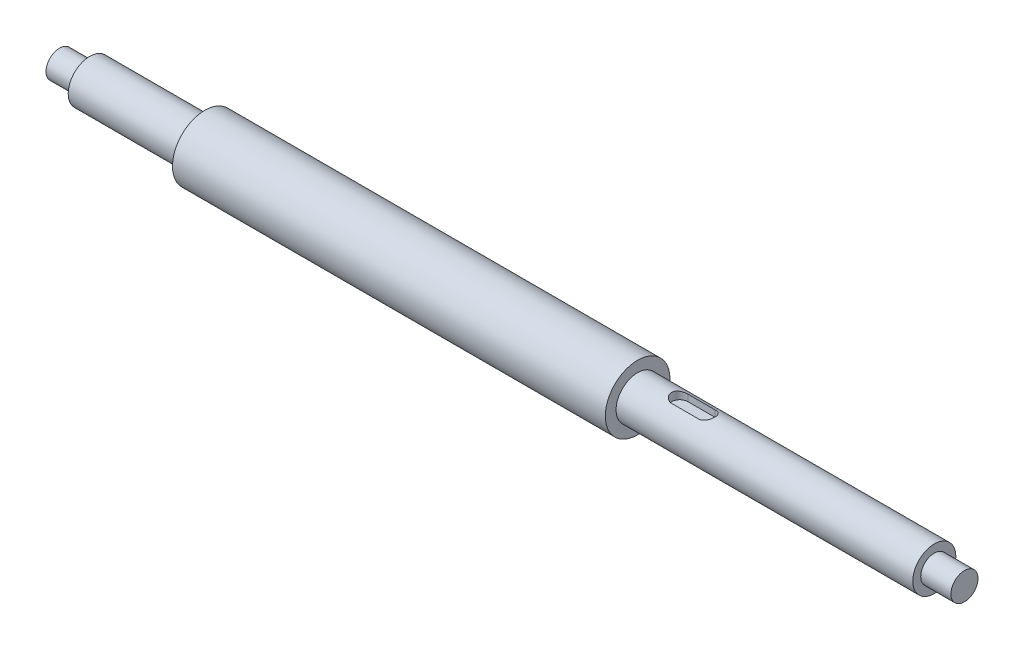
ISO-10303-21;
HEADER;
FILE_DESCRIPTION(('STEP AP214'),'2;1');
FILE_NAME('part.step','',(''),(''),'','','');
FILE_SCHEMA(('AUTOMOTIVE_DESIGN { 1 0 10303 214 1 1 1 1 }'));
ENDSEC;
DATA;
#1=APPLICATION_CONTEXT('core data for automotive mechanical design processes');
#2=APPLICATION_PROTOCOL_DEFINITION('international standard','automotive_design',2000,#1);
#3=PRODUCT_CONTEXT('',#1,'mechanical');
#4=PRODUCT('Part','Part','',(#3));
#5=PRODUCT_RELATED_PRODUCT_CATEGORY('part','',(#4));
#6=PRODUCT_DEFINITION_FORMATION('','',#4);
#7=PRODUCT_DEFINITION_CONTEXT('part definition',#1,'design');
#8=PRODUCT_DEFINITION('design','',#6,#7);
#9=PRODUCT_DEFINITION_SHAPE('','',#8);
#10=(LENGTH_UNIT() NAMED_UNIT(*) SI_UNIT(.MILLI.,.METRE.));
#11=(NAMED_UNIT(*) PLANE_ANGLE_UNIT() SI_UNIT($,.RADIAN.));
#12=(NAMED_UNIT(*) SI_UNIT($,.STERADIAN.) SOLID_ANGLE_UNIT());
#13=UNCERTAINTY_MEASURE_WITH_UNIT(LENGTH_MEASURE(1.E-05),#10,'distance_accuracy_value','');
#14=(GEOMETRIC_REPRESENTATION_CONTEXT(3) GLOBAL_UNCERTAINTY_ASSIGNED_CONTEXT((#13)) GLOBAL_UNIT_ASSIGNED_CONTEXT((#10,
#11,#12)) REPRESENTATION_CONTEXT('',''));
#15=CARTESIAN_POINT('',(0.,0.,0.));
#16=DIRECTION('',(0.,0.,1.));
#17=DIRECTION('',(1.,0.,0.));
#18=AXIS2_PLACEMENT_3D('',#15,#16,#17);
#19=CARTESIAN_POINT('',(170.3705,0.,0.));
#20=DIRECTION('',(1.,0.,0.));
#21=DIRECTION('',(0.,0.,-1.));
#22=AXIS2_PLACEMENT_3D('',#19,#20,#21);
#23=CYLINDRICAL_SURFACE('',#22,6.35);
#24=CARTESIAN_POINT('',(190.7286,5.88660754913218,2.38125000000001));
#25=CARTESIAN_POINT('',(190.793022690709,5.88659548978226,2.38125913009066));
#26=CARTESIAN_POINT('',(190.857438761514,5.88766481762426,2.37863587752652));
#27=CARTESIAN_POINT('',(190.985759428447,5.89187627506284,2.36819587169677));
#28=CARTESIAN_POINT('',(191.049664189017,5.89501770870095,2.36038086218097));
#29=CARTESIAN_POINT('',(191.176283215817,5.90326887586656,2.33966527786342));
#30=CARTESIAN_POINT('',(191.239000897483,5.90837159707846,2.32678281724141));
#31=CARTESIAN_POINT('',(191.363022489217,5.92037365929628,2.29607189211602));
#32=CARTESIAN_POINT('',(191.42432632721,5.92727309167544,2.27824317606367));
#33=CARTESIAN_POINT('',(191.605386908343,5.95034770392959,2.21760056465341));
#34=CARTESIAN_POINT('',(191.722518678819,5.96891509765018,2.16759271249364));
#35=CARTESIAN_POINT('',(191.946767896638,6.01031361974633,2.04999893449497));
#36=CARTESIAN_POINT('',(192.053877049666,6.03314823347984,1.9823986217298));
#37=CARTESIAN_POINT('',(192.260358513306,6.0817692865106,1.82795372701336));
#38=CARTESIAN_POINT('',(192.359166909958,6.10764225891527,1.74038090759022));
#39=CARTESIAN_POINT('',(192.541088192072,6.15870284454295,1.5500260305332));
#40=CARTESIAN_POINT('',(192.62419803932,6.1838903242937,1.44724103566693));
#41=CARTESIAN_POINT('',(192.775109530779,6.23177717528256,1.22506388505923));
#42=CARTESIAN_POINT('',(192.842293553956,6.25436262019899,1.10522541598501));
#43=CARTESIAN_POINT('',(192.955310058418,6.29345381482321,0.854953847338861));
#44=CARTESIAN_POINT('',(193.001150500312,6.30996183077482,0.724524719162075));
#45=CARTESIAN_POINT('',(193.06819034107,6.33442171009888,0.462740462488136));
#46=CARTESIAN_POINT('',(193.090367212537,6.34271188412668,0.331667882509103));
#47=CARTESIAN_POINT('',(193.112582411759,6.35101622276703,0.067414516862528));
#48=CARTESIAN_POINT('',(193.11262755105,6.35103293372286,-0.0657656075414556));
#49=CARTESIAN_POINT('',(193.091146380114,6.34300331869488,-0.323443758391492));
#50=CARTESIAN_POINT('',(193.070687207439,6.33535587077507,-0.448045336451245));
#51=CARTESIAN_POINT('',(193.010573670279,6.31338053854789,-0.691896438267902));
#52=CARTESIAN_POINT('',(192.970918215805,6.29905227489671,-0.811145657690647));
#53=CARTESIAN_POINT('',(192.873042001571,6.26487460828666,-1.04296990601517));
#54=CARTESIAN_POINT('',(192.814559377485,6.24494786671162,-1.15542250183511));
#55=CARTESIAN_POINT('',(192.680920140402,6.2015896125325,-1.36919723045466));
#56=CARTESIAN_POINT('',(192.605758104676,6.1781569609131,-1.47051572733593));
#57=CARTESIAN_POINT('',(192.435760778743,6.12858570839014,-1.66542402633577));
#58=CARTESIAN_POINT('',(192.340032539864,6.102368999608,-1.75821624577153));
#59=CARTESIAN_POINT('',(192.134197686679,6.05127511190241,-1.9267443869004));
#60=CARTESIAN_POINT('',(192.024085447748,6.02639846238961,-2.00247360465934));
#61=CARTESIAN_POINT('',(191.789434129892,5.98030090356382,-2.13626697322262));
#62=CARTESIAN_POINT('',(191.664624281002,5.95917580861293,-2.19389105876173));
#63=CARTESIAN_POINT('',(191.406134964076,5.92409675575384,-2.2869384432745));
#64=CARTESIAN_POINT('',(191.272470824669,5.91013075232921,-2.32239905555698));
#65=CARTESIAN_POINT('',(191.069307634484,5.89607385128455,-2.35774344632942));
#66=CARTESIAN_POINT('',(191.001487551886,5.89253768789074,-2.36655020107226));
#67=CARTESIAN_POINT('',(190.865324915666,5.88780085364897,-2.37830215533811));
#68=CARTESIAN_POINT('',(190.796982907066,5.88659801217854,-2.38125280268899));
#69=CARTESIAN_POINT('',(190.7286,5.88660754913219,-2.38124999999999));
#70=B_SPLINE_CURVE_WITH_KNOTS('',3,(#24,#25,#26,#27,#28,#29,#30,#31,#32,#33,#34,#35,#36,#37,#38,
#39,#40,#41,#42,#43,#44,#45,#46,#47,#48,#49,#50,#51,#52,#53,#54,#55,#56,#57,#58,#59,#60,#61,#62,
#63,#64,#65,#66,#67,#68,#69),.UNSPECIFIED.,.F.,.F.,(4,2,2,2,2,2,2,2,2,2,2,2,2,2,2,2,2,2,2,2,2,2,
4),(0.,0.193194726745108,0.386324598168466,0.57877028854756,0.771225767825263,1.15545658008769,
1.54000260504615,1.94182796306957,2.34373100873049,2.75931921641233,3.17475229591794,
3.57226821532385,3.96966179024043,4.34739430738592,4.7251482751968,5.10840147691071,
5.49177946305821,5.89755993176865,6.30349955186249,6.71865488111544,7.13310937965229,
7.33829571728318,7.54329108423838),.UNSPECIFIED.);
#71=CARTESIAN_POINT('',(190.7286,5.88660754913218,2.38125000000001));
#72=VERTEX_POINT('',#71);
#73=CARTESIAN_POINT('',(190.7286,5.88660754913219,-2.38124999999999));
#74=VERTEX_POINT('',#73);
#75=EDGE_CURVE('E132',#72,#74,#70,.T.);
#76=ORIENTED_EDGE('',*,*,#75,.F.);
#77=DIRECTION('',(1.,0.,0.));
#78=VECTOR('',#77,1.);
#79=CARTESIAN_POINT('',(170.3705,5.88660754913218,2.38125000000002));
#80=LINE('',#79,#78);
#81=CARTESIAN_POINT('',(182.7911,5.88660754913218,2.38125000000001));
#82=VERTEX_POINT('',#81);
#83=EDGE_CURVE('E11',#82,#72,#80,.T.);
#84=ORIENTED_EDGE('',*,*,#83,.F.);
#85=CARTESIAN_POINT('',(182.7911,5.88660754913219,-2.38124999999999));
#86=CARTESIAN_POINT('',(182.726677309291,5.88659548978227,-2.38125913009064));
#87=CARTESIAN_POINT('',(182.662261238486,5.88766481762427,-2.3786358775265));
#88=CARTESIAN_POINT('',(182.533940571553,5.89187627506284,-2.36819587169675));
#89=CARTESIAN_POINT('',(182.470035810983,5.89501770870096,-2.36038086218095));
#90=CARTESIAN_POINT('',(182.343416784183,5.90326887586656,-2.3396652778634));
#91=CARTESIAN_POINT('',(182.280699102517,5.90837159707847,-2.32678281724139));
#92=CARTESIAN_POINT('',(182.156677510783,5.92037365929629,-2.296071892116));
#93=CARTESIAN_POINT('',(182.09537367279,5.92727309167545,-2.27824317606365));
#94=CARTESIAN_POINT('',(181.914313091657,5.9503477039296,-2.21760056465339));
#95=CARTESIAN_POINT('',(181.797181321181,5.96891509765019,-2.16759271249363));
#96=CARTESIAN_POINT('',(181.572932103362,6.01031361974633,-2.04999893449496));
#97=CARTESIAN_POINT('',(181.465822950334,6.03314823347984,-1.98239862172978));
#98=CARTESIAN_POINT('',(181.259341486694,6.08176928651061,-1.82795372701334));
#99=CARTESIAN_POINT('',(181.160533090042,6.10764225891527,-1.7403809075902));
#100=CARTESIAN_POINT('',(180.978611807928,6.15870284454295,-1.55002603053317));
#101=CARTESIAN_POINT('',(180.89550196068,6.1838903242937,-1.44724103566691));
#102=CARTESIAN_POINT('',(180.744590469221,6.23177717528256,-1.22506388505921));
#103=CARTESIAN_POINT('',(180.677406446044,6.254362620199,-1.10522541598498));
#104=CARTESIAN_POINT('',(180.564389941582,6.29345381482321,-0.854953847338833));
#105=CARTESIAN_POINT('',(180.518549499688,6.30996183077482,-0.724524719162051));
#106=CARTESIAN_POINT('',(180.451509658929,6.33442171009888,-0.462740462488115));
#107=CARTESIAN_POINT('',(180.429332787463,6.34271188412668,-0.331667882509082));
#108=CARTESIAN_POINT('',(180.407117588241,6.35101622276703,-0.0674145168625059));
#109=CARTESIAN_POINT('',(180.407072448949,6.35103293372286,0.0657656075414779));
#110=CARTESIAN_POINT('',(180.428553619886,6.34300331869488,0.323443758391516));
#111=CARTESIAN_POINT('',(180.449012792561,6.33535587077507,0.448045336451272));
#112=CARTESIAN_POINT('',(180.509126329721,6.31338053854788,0.69189643826793));
#113=CARTESIAN_POINT('',(180.548781784195,6.2990522748967,0.811145657690672));
#114=CARTESIAN_POINT('',(180.646657998429,6.26487460828666,1.04296990601519));
#115=CARTESIAN_POINT('',(180.705140622515,6.24494786671162,1.15542250183512));
#116=CARTESIAN_POINT('',(180.838779859598,6.20158961253249,1.36919723045468));
#117=CARTESIAN_POINT('',(180.913941895324,6.17815696091309,1.47051572733595));
#118=CARTESIAN_POINT('',(181.083939221256,6.12858570839014,1.6654240263358));
#119=CARTESIAN_POINT('',(181.179667460136,6.10236899960799,1.75821624577155));
#120=CARTESIAN_POINT('',(181.385502313321,6.0512751119024,1.92674438690042));
#121=CARTESIAN_POINT('',(181.495614552252,6.0263984623896,2.00247360465936));
#122=CARTESIAN_POINT('',(181.730265870108,5.98030090356381,2.13626697322264));
#123=CARTESIAN_POINT('',(181.855075718998,5.95917580861292,2.19389105876174));
#124=CARTESIAN_POINT('',(182.113565035924,5.92409675575384,2.28693844327452));
#125=CARTESIAN_POINT('',(182.247229175331,5.91013075232921,2.322399055557));
#126=CARTESIAN_POINT('',(182.450392365516,5.89607385128454,2.35774344632944));
#127=CARTESIAN_POINT('',(182.518212448114,5.89253768789073,2.36655020107229));
#128=CARTESIAN_POINT('',(182.654375084334,5.88780085364896,2.37830215533813));
#129=CARTESIAN_POINT('',(182.722717092934,5.88659801217853,2.38125280268901));
#130=CARTESIAN_POINT('',(182.7911,5.88660754913218,2.38125000000001));
#131=B_SPLINE_CURVE_WITH_KNOTS('',3,(#85,#86,#87,#88,#89,#90,#91,#92,#93,#94,#95,#96,#97,#98,
#99,#100,#101,#102,#103,#104,#105,#106,#107,#108,#109,#110,#111,#112,#113,#114,#115,#116,#117,
#118,#119,#120,#121,#122,#123,#124,#125,#126,#127,#128,#129,#130),.UNSPECIFIED.,.F.,.F.,(4,2,2,
2,2,2,2,2,2,2,2,2,2,2,2,2,2,2,2,2,2,2,4),(0.,0.19319472674508,0.386324598168438,
0.57877028854756,0.771225767825263,1.15545658008766,1.54000260504615,1.94182796306957,
2.34373100873049,2.75931921641234,3.17475229591794,3.57226821532385,3.96966179024043,
4.34739430738593,4.7251482751968,5.1084014769107,5.49177946305821,5.89755993176865,
6.30349955186249,6.71865488111541,7.13310937965229,7.3382957172832,7.54329108423838),.UNSPECIFIED.);
#132=CARTESIAN_POINT('',(182.7911,5.88660754913219,-2.38124999999999));
#133=VERTEX_POINT('',#132);
#134=EDGE_CURVE('E41',#133,#82,#131,.T.);
#135=ORIENTED_EDGE('',*,*,#134,.F.);
#136=DIRECTION('',(1.,0.,0.));
#137=VECTOR('',#136,1.);
#138=CARTESIAN_POINT('',(170.3705,5.88660754913219,-2.38124999999999));
#139=LINE('',#138,#137);
#140=EDGE_CURVE('E140',#74,#133,#139,.F.);
#141=ORIENTED_EDGE('',*,*,#140,.F.);
#142=EDGE_LOOP('',(#76,#84,#135,#141));
#143=FACE_BOUND('',#142,.T.);
#144=CARTESIAN_POINT('',(170.3705,0.,0.));
#145=DIRECTION('',(1.,0.,0.));
#146=DIRECTION('',(0.,0.,-1.));
#147=AXIS2_PLACEMENT_3D('',#144,#145,#146);
#148=CIRCLE('',#147,6.35);
#149=CARTESIAN_POINT('',(170.3705,0.,-6.35));
#150=VERTEX_POINT('',#149);
#151=EDGE_CURVE('E111',#150,#150,#148,.T.);
#152=ORIENTED_EDGE('',*,*,#151,.T.);
#153=EDGE_LOOP('',(#152));
#154=FACE_BOUND('',#153,.T.);
#155=CARTESIAN_POINT('',(257.81,0.,0.));
#156=DIRECTION('',(-1.,0.,0.));
#157=DIRECTION('',(0.,0.,1.));
#158=AXIS2_PLACEMENT_3D('',#155,#156,#157);
#159=CIRCLE('',#158,6.35);
#160=CARTESIAN_POINT('',(257.81,0.,6.35));
#161=VERTEX_POINT('',#160);
#162=EDGE_CURVE('E106',#161,#161,#159,.T.);
#163=ORIENTED_EDGE('',*,*,#162,.T.);
#164=EDGE_LOOP('',(#163));
#165=FACE_BOUND('',#164,.T.);
#166=ADVANCED_FACE('F33',(#143,#154,#165),#23,.T.);
#167=CARTESIAN_POINT('',(266.7,0.,0.));
#168=DIRECTION('',(-1.,0.,0.));
#169=DIRECTION('',(0.,0.,1.));
#170=AXIS2_PLACEMENT_3D('',#167,#168,#169);
#171=CYLINDRICAL_SURFACE('',#170,9.525);
#172=CARTESIAN_POINT('',(42.799,0.,0.));
#173=DIRECTION('',(-1.,0.,0.));
#174=DIRECTION('',(0.,0.,1.));
#175=AXIS2_PLACEMENT_3D('',#172,#173,#174);
#176=CIRCLE('',#175,9.525);
#177=CARTESIAN_POINT('',(42.799,0.,9.525));
#178=VERTEX_POINT('',#177);
#179=EDGE_CURVE('E129',#178,#178,#176,.T.);
#180=ORIENTED_EDGE('',*,*,#179,.F.);
#181=EDGE_LOOP('',(#180));
#182=FACE_BOUND('',#181,.T.);
#183=CARTESIAN_POINT('',(170.3705,0.,0.));
#184=DIRECTION('',(1.,0.,0.));
#185=DIRECTION('',(0.,0.,-1.));
#186=AXIS2_PLACEMENT_3D('',#183,#184,#185);
#187=CIRCLE('',#186,9.525);
#188=CARTESIAN_POINT('',(170.3705,0.,-9.525));
#189=VERTEX_POINT('',#188);
#190=EDGE_CURVE('E114',#189,#189,#187,.T.);
#191=ORIENTED_EDGE('',*,*,#190,.F.);
#192=EDGE_LOOP('',(#191));
#193=FACE_BOUND('',#192,.T.);
#194=ADVANCED_FACE('F35',(#182,#193),#171,.T.);
#195=CARTESIAN_POINT('',(42.799,0.,0.));
#196=DIRECTION('',(-1.,0.,0.));
#197=DIRECTION('',(0.,0.,1.));
#198=AXIS2_PLACEMENT_3D('',#195,#196,#197);
#199=CYLINDRICAL_SURFACE('',#198,6.35);
#200=CARTESIAN_POINT('',(42.799,0.,0.));
#201=DIRECTION('',(-1.,0.,0.));
#202=DIRECTION('',(0.,0.,1.));
#203=AXIS2_PLACEMENT_3D('',#200,#201,#202);
#204=CIRCLE('',#203,6.35);
#205=CARTESIAN_POINT('',(42.799,0.,6.35));
#206=VERTEX_POINT('',#205);
#207=EDGE_CURVE('E126',#206,#206,#204,.T.);
#208=ORIENTED_EDGE('',*,*,#207,.T.);
#209=EDGE_LOOP('',(#208));
#210=FACE_BOUND('',#209,.T.);
#211=CARTESIAN_POINT('',(8.89,0.,0.));
#212=DIRECTION('',(-1.,0.,0.));
#213=DIRECTION('',(0.,0.,1.));
#214=AXIS2_PLACEMENT_3D('',#211,#212,#213);
#215=CIRCLE('',#214,6.35);
#216=CARTESIAN_POINT('',(8.89,0.,6.35));
#217=VERTEX_POINT('',#216);
#218=EDGE_CURVE('E121',#217,#217,#215,.T.);
#219=ORIENTED_EDGE('',*,*,#218,.F.);
#220=EDGE_LOOP('',(#219));
#221=FACE_BOUND('',#220,.T.);
#222=ADVANCED_FACE('F206',(#210,#221),#199,.T.);
#223=CARTESIAN_POINT('',(42.799,0.,0.));
#224=DIRECTION('',(-1.,0.,0.));
#225=DIRECTION('',(0.,0.,1.));
#226=AXIS2_PLACEMENT_3D('',#223,#224,#225);
#227=PLANE('',#226);
#228=ORIENTED_EDGE('',*,*,#207,.F.);
#229=EDGE_LOOP('',(#228));
#230=FACE_BOUND('',#229,.T.);
#231=ORIENTED_EDGE('',*,*,#179,.T.);
#232=EDGE_LOOP('',(#231));
#233=FACE_BOUND('',#232,.T.);
#234=ADVANCED_FACE('F185',(#230,#233),#227,.T.);
#235=CARTESIAN_POINT('',(8.89,0.,0.));
#236=DIRECTION('',(-1.,0.,0.));
#237=DIRECTION('',(0.,0.,1.));
#238=AXIS2_PLACEMENT_3D('',#235,#236,#237);
#239=PLANE('',#238);
#240=CARTESIAN_POINT('',(8.89,0.,0.));
#241=DIRECTION('',(-1.,0.,0.));
#242=DIRECTION('',(0.,0.,1.));
#243=AXIS2_PLACEMENT_3D('',#240,#241,#242);
#244=CIRCLE('',#243,4.);
#245=CARTESIAN_POINT('',(8.89,0.,4.));
#246=VERTEX_POINT('',#245);
#247=EDGE_CURVE('E118',#246,#246,#244,.T.);
#248=ORIENTED_EDGE('',*,*,#247,.F.);
#249=EDGE_LOOP('',(#248));
#250=FACE_BOUND('',#249,.T.);
#251=ORIENTED_EDGE('',*,*,#218,.T.);
#252=EDGE_LOOP('',(#251));
#253=FACE_BOUND('',#252,.T.);
#254=ADVANCED_FACE('F196',(#250,#253),#239,.T.);
#255=CARTESIAN_POINT('',(8.89,0.,0.));
#256=DIRECTION('',(-1.,0.,0.));
#257=DIRECTION('',(0.,0.,1.));
#258=AXIS2_PLACEMENT_3D('',#255,#256,#257);
#259=CYLINDRICAL_SURFACE('',#258,4.);
#260=ORIENTED_EDGE('',*,*,#247,.T.);
#261=EDGE_LOOP('',(#260));
#262=FACE_BOUND('',#261,.T.);
#263=CARTESIAN_POINT('',(0.,0.,0.));
#264=DIRECTION('',(-1.,0.,0.));
#265=DIRECTION('',(0.,0.,1.));
#266=AXIS2_PLACEMENT_3D('',#263,#264,#265);
#267=CIRCLE('',#266,4.);
#268=CARTESIAN_POINT('',(0.,0.,4.));
#269=VERTEX_POINT('',#268);
#270=EDGE_CURVE('E117',#269,#269,#267,.T.);
#271=ORIENTED_EDGE('',*,*,#270,.F.);
#272=EDGE_LOOP('',(#271));
#273=FACE_BOUND('',#272,.T.);
#274=ADVANCED_FACE('F189',(#262,#273),#259,.T.);
#275=CARTESIAN_POINT('',(0.,0.,0.));
#276=DIRECTION('',(1.,0.,0.));
#277=DIRECTION('',(0.,0.,-1.));
#278=AXIS2_PLACEMENT_3D('',#275,#276,#277);
#279=PLANE('',#278);
#280=ORIENTED_EDGE('',*,*,#270,.T.);
#281=EDGE_LOOP('',(#280));
#282=FACE_BOUND('',#281,.T.);
#283=ADVANCED_FACE('F187',(#282),#279,.F.);
#284=CARTESIAN_POINT('',(170.3705,0.,0.));
#285=DIRECTION('',(1.,0.,0.));
#286=DIRECTION('',(0.,0.,-1.));
#287=AXIS2_PLACEMENT_3D('',#284,#285,#286);
#288=PLANE('',#287);
#289=ORIENTED_EDGE('',*,*,#151,.F.);
#290=EDGE_LOOP('',(#289));
#291=FACE_BOUND('',#290,.T.);
#292=ORIENTED_EDGE('',*,*,#190,.T.);
#293=EDGE_LOOP('',(#292));
#294=FACE_BOUND('',#293,.T.);
#295=ADVANCED_FACE('F173',(#291,#294),#288,.T.);
#296=CARTESIAN_POINT('',(257.81,0.,0.));
#297=DIRECTION('',(1.,0.,0.));
#298=DIRECTION('',(0.,0.,1.));
#299=AXIS2_PLACEMENT_3D('',#296,#297,#298);
#300=PLANE('',#299);
#301=ORIENTED_EDGE('',*,*,#162,.F.);
#302=EDGE_LOOP('',(#301));
#303=FACE_BOUND('',#302,.T.);
#304=CARTESIAN_POINT('',(257.81,0.,0.));
#305=DIRECTION('',(-1.,0.,0.));
#306=DIRECTION('',(0.,0.,1.));
#307=AXIS2_PLACEMENT_3D('',#304,#305,#306);
#308=CIRCLE('',#307,4.);
#309=CARTESIAN_POINT('',(257.81,0.,4.));
#310=VERTEX_POINT('',#309);
#311=EDGE_CURVE('E103',#310,#310,#308,.T.);
#312=ORIENTED_EDGE('',*,*,#311,.T.);
#313=EDGE_LOOP('',(#312));
#314=FACE_BOUND('',#313,.T.);
#315=ADVANCED_FACE('F170',(#303,#314),#300,.T.);
#316=CARTESIAN_POINT('',(257.81,0.,0.));
#317=DIRECTION('',(1.,0.,0.));
#318=DIRECTION('',(0.,0.,-1.));
#319=AXIS2_PLACEMENT_3D('',#316,#317,#318);
#320=CYLINDRICAL_SURFACE('',#319,4.);
#321=ORIENTED_EDGE('',*,*,#311,.F.);
#322=EDGE_LOOP('',(#321));
#323=FACE_BOUND('',#322,.T.);
#324=CARTESIAN_POINT('',(266.7,0.,0.));
#325=DIRECTION('',(-1.,0.,0.));
#326=DIRECTION('',(0.,0.,1.));
#327=AXIS2_PLACEMENT_3D('',#324,#325,#326);
#328=CIRCLE('',#327,4.);
#329=CARTESIAN_POINT('',(266.7,0.,4.));
#330=VERTEX_POINT('',#329);
#331=EDGE_CURVE('E98',#330,#330,#328,.T.);
#332=ORIENTED_EDGE('',*,*,#331,.T.);
#333=EDGE_LOOP('',(#332));
#334=FACE_BOUND('',#333,.T.);
#335=ADVANCED_FACE('F158',(#323,#334),#320,.T.);
#336=CARTESIAN_POINT('',(266.7,0.,0.));
#337=DIRECTION('',(1.,0.,0.));
#338=DIRECTION('',(0.,0.,-1.));
#339=AXIS2_PLACEMENT_3D('',#336,#337,#338);
#340=PLANE('',#339);
#341=ORIENTED_EDGE('',*,*,#331,.F.);
#342=EDGE_LOOP('',(#341));
#343=FACE_BOUND('',#342,.T.);
#344=ADVANCED_FACE('F157',(#343),#340,.T.);
#345=CARTESIAN_POINT('',(182.7911,3.9624,0.));
#346=DIRECTION('',(0.,1.,0.));
#347=DIRECTION('',(0.,0.,1.));
#348=AXIS2_PLACEMENT_3D('',#345,#346,#347);
#349=CYLINDRICAL_SURFACE('',#348,2.38125);
#350=DIRECTION('',(0.,1.,0.));
#351=VECTOR('',#350,1.);
#352=CARTESIAN_POINT('',(182.7911,3.9624,-2.38124999999999));
#353=LINE('',#352,#351);
#354=CARTESIAN_POINT('',(182.7911,3.9624,-2.38124999999999));
#355=VERTEX_POINT('',#354);
#356=EDGE_CURVE('E96',#355,#133,#353,.T.);
#357=ORIENTED_EDGE('',*,*,#356,.T.);
#358=ORIENTED_EDGE('',*,*,#134,.T.);
#359=DIRECTION('',(0.,1.,0.));
#360=VECTOR('',#359,1.);
#361=CARTESIAN_POINT('',(182.7911,3.9624,2.38125000000001));
#362=LINE('',#361,#360);
#363=CARTESIAN_POINT('',(182.7911,3.9624,2.38125000000001));
#364=VERTEX_POINT('',#363);
#365=EDGE_CURVE('E47',#364,#82,#362,.T.);
#366=ORIENTED_EDGE('',*,*,#365,.F.);
#367=CARTESIAN_POINT('',(182.7911,3.9624,0.));
#368=DIRECTION('',(0.,1.,0.));
#369=DIRECTION('',(0.,0.,1.));
#370=AXIS2_PLACEMENT_3D('',#367,#368,#369);
#371=CIRCLE('',#370,2.38125);
#372=EDGE_CURVE('E76',#355,#364,#371,.T.);
#373=ORIENTED_EDGE('',*,*,#372,.F.);
#374=EDGE_LOOP('',(#357,#358,#366,#373));
#375=FACE_BOUND('',#374,.T.);
#376=ADVANCED_FACE('F74',(#375),#349,.F.);
#377=CARTESIAN_POINT('',(182.7911,3.9624,-2.38124999999999));
#378=DIRECTION('',(0.,0.,-1.));
#379=DIRECTION('',(-1.,0.,0.));
#380=AXIS2_PLACEMENT_3D('',#377,#378,#379);
#381=PLANE('',#380);
#382=ORIENTED_EDGE('',*,*,#140,.T.);
#383=ORIENTED_EDGE('',*,*,#356,.F.);
#384=DIRECTION('',(-1.,0.,0.));
#385=VECTOR('',#384,1.);
#386=CARTESIAN_POINT('',(182.7911,3.9624,-2.38124999999999));
#387=LINE('',#386,#385);
#388=CARTESIAN_POINT('',(190.7286,3.9624,-2.38124999999999));
#389=VERTEX_POINT('',#388);
#390=EDGE_CURVE('E79',#389,#355,#387,.T.);
#391=ORIENTED_EDGE('',*,*,#390,.F.);
#392=DIRECTION('',(0.,1.,0.));
#393=VECTOR('',#392,1.);
#394=CARTESIAN_POINT('',(190.7286,3.9624,-2.38124999999999));
#395=LINE('',#394,#393);
#396=EDGE_CURVE('E99',#389,#74,#395,.T.);
#397=ORIENTED_EDGE('',*,*,#396,.T.);
#398=EDGE_LOOP('',(#382,#383,#391,#397));
#399=FACE_BOUND('',#398,.T.);
#400=ADVANCED_FACE('F149',(#399),#381,.F.);
#401=CARTESIAN_POINT('',(190.7286,3.9624,0.));
#402=DIRECTION('',(0.,1.,0.));
#403=DIRECTION('',(0.,0.,1.));
#404=AXIS2_PLACEMENT_3D('',#401,#402,#403);
#405=CYLINDRICAL_SURFACE('',#404,2.38125);
#406=DIRECTION('',(0.,1.,0.));
#407=VECTOR('',#406,1.);
#408=CARTESIAN_POINT('',(190.7286,3.9624,2.38125000000001));
#409=LINE('',#408,#407);
#410=CARTESIAN_POINT('',(190.7286,3.9624,2.38125000000001));
#411=VERTEX_POINT('',#410);
#412=EDGE_CURVE('E78',#411,#72,#409,.T.);
#413=ORIENTED_EDGE('',*,*,#412,.T.);
#414=ORIENTED_EDGE('',*,*,#75,.T.);
#415=ORIENTED_EDGE('',*,*,#396,.F.);
#416=CARTESIAN_POINT('',(190.7286,3.9624,0.));
#417=DIRECTION('',(0.,1.,0.));
#418=DIRECTION('',(0.,0.,1.));
#419=AXIS2_PLACEMENT_3D('',#416,#417,#418);
#420=CIRCLE('',#419,2.38125);
#421=EDGE_CURVE('E88',#411,#389,#420,.T.);
#422=ORIENTED_EDGE('',*,*,#421,.F.);
#423=EDGE_LOOP('',(#413,#414,#415,#422));
#424=FACE_BOUND('',#423,.T.);
#425=ADVANCED_FACE('F144',(#424),#405,.F.);
#426=CARTESIAN_POINT('',(182.7911,3.9624,2.38125000000001));
#427=DIRECTION('',(0.,0.,1.));
#428=DIRECTION('',(1.,0.,0.));
#429=AXIS2_PLACEMENT_3D('',#426,#427,#428);
#430=PLANE('',#429);
#431=ORIENTED_EDGE('',*,*,#83,.T.);
#432=ORIENTED_EDGE('',*,*,#412,.F.);
#433=DIRECTION('',(1.,0.,0.));
#434=VECTOR('',#433,1.);
#435=CARTESIAN_POINT('',(182.7911,3.9624,2.38125000000001));
#436=LINE('',#435,#434);
#437=EDGE_CURVE('E82',#364,#411,#436,.T.);
#438=ORIENTED_EDGE('',*,*,#437,.F.);
#439=ORIENTED_EDGE('',*,*,#365,.T.);
#440=EDGE_LOOP('',(#431,#432,#438,#439));
#441=FACE_BOUND('',#440,.T.);
#442=ADVANCED_FACE('F83',(#441),#430,.F.);
#443=CARTESIAN_POINT('',(182.7911,3.9624,0.));
#444=DIRECTION('',(0.,1.,0.));
#445=DIRECTION('',(0.,0.,1.));
#446=AXIS2_PLACEMENT_3D('',#443,#444,#445);
#447=PLANE('',#446);
#448=ORIENTED_EDGE('',*,*,#372,.T.);
#449=ORIENTED_EDGE('',*,*,#437,.T.);
#450=ORIENTED_EDGE('',*,*,#421,.T.);
#451=ORIENTED_EDGE('',*,*,#390,.T.);
#452=EDGE_LOOP('',(#448,#449,#450,#451));
#453=FACE_BOUND('',#452,.T.);
#454=ADVANCED_FACE('F90',(#453),#447,.T.);
#455=CLOSED_SHELL('',(#166,#194,#222,#234,#254,#274,#283,#295,#315,#335,#344,#376,#400,#425,
#442,#454));
#456=MANIFOLD_SOLID_BREP('B2',#455);
#457=ADVANCED_BREP_SHAPE_REPRESENTATION('',(#18,#456),#14);
#458=SHAPE_DEFINITION_REPRESENTATION(#9,#457);
ENDSEC;
END-ISO-10303-21;
